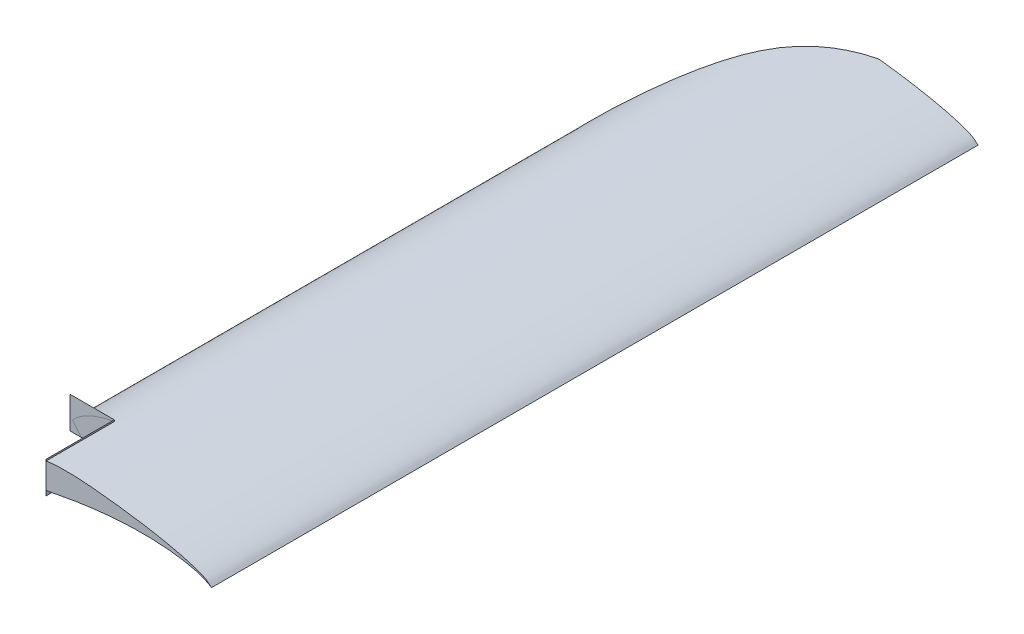
ISO-10303-21;
HEADER;
FILE_DESCRIPTION(('STEP AP214'),'2;1');
FILE_NAME('part.step','',(''),(''),'','','');
FILE_SCHEMA(('AUTOMOTIVE_DESIGN { 1 0 10303 214 1 1 1 1 }'));
ENDSEC;
DATA;
#1=APPLICATION_CONTEXT('core data for automotive mechanical design processes');
#2=APPLICATION_PROTOCOL_DEFINITION('international standard','automotive_design',2000,#1);
#3=PRODUCT_CONTEXT('',#1,'mechanical');
#4=PRODUCT('Part','Part','',(#3));
#5=PRODUCT_RELATED_PRODUCT_CATEGORY('part','',(#4));
#6=PRODUCT_DEFINITION_FORMATION('','',#4);
#7=PRODUCT_DEFINITION_CONTEXT('part definition',#1,'design');
#8=PRODUCT_DEFINITION('design','',#6,#7);
#9=PRODUCT_DEFINITION_SHAPE('','',#8);
#10=(LENGTH_UNIT() NAMED_UNIT(*) SI_UNIT(.MILLI.,.METRE.));
#11=(NAMED_UNIT(*) PLANE_ANGLE_UNIT() SI_UNIT($,.RADIAN.));
#12=(NAMED_UNIT(*) SI_UNIT($,.STERADIAN.) SOLID_ANGLE_UNIT());
#13=UNCERTAINTY_MEASURE_WITH_UNIT(LENGTH_MEASURE(1.E-05),#10,'distance_accuracy_value','');
#14=(GEOMETRIC_REPRESENTATION_CONTEXT(3) GLOBAL_UNCERTAINTY_ASSIGNED_CONTEXT((#13)) GLOBAL_UNIT_ASSIGNED_CONTEXT((#10,
#11,#12)) REPRESENTATION_CONTEXT('',''));
#15=CARTESIAN_POINT('',(0.,0.,0.));
#16=DIRECTION('',(0.,0.,1.));
#17=DIRECTION('',(1.,0.,0.));
#18=AXIS2_PLACEMENT_3D('',#15,#16,#17);
#19=CARTESIAN_POINT('',(-0.000448500784880232,0.,84.4464684884602));
#20=DIRECTION('',(0.,0.,1.));
#21=DIRECTION('',(1.,0.,0.));
#22=AXIS2_PLACEMENT_3D('',#19,#20,#21);
#23=PLANE('',#22);
#24=DIRECTION('',(1.,0.,0.));
#25=VECTOR('',#24,1.);
#26=CARTESIAN_POINT('',(-0.000448500784880232,3.43906675841477,84.4464684884602));
#27=LINE('',#26,#25);
#28=CARTESIAN_POINT('',(-0.000448500784880232,3.43906675841477,84.4464684884602));
#29=VERTEX_POINT('',#28);
#30=CARTESIAN_POINT('',(5.38107816998865,3.43906675841477,84.4464684884602));
#31=VERTEX_POINT('',#30);
#32=EDGE_CURVE('E60',#29,#31,#27,.T.);
#33=ORIENTED_EDGE('',*,*,#32,.F.);
#34=DIRECTION('',(0.,1.,0.));
#35=VECTOR('',#34,1.);
#36=CARTESIAN_POINT('',(-0.000448500784880232,0.,84.4464684884602));
#37=LINE('',#36,#35);
#38=CARTESIAN_POINT('',(-0.000448500784880232,-0.404933087172944,84.4464684884602));
#39=VERTEX_POINT('',#38);
#40=EDGE_CURVE('E12',#39,#29,#37,.T.);
#41=ORIENTED_EDGE('',*,*,#40,.F.);
#42=DIRECTION('',(1.,0.,0.));
#43=VECTOR('',#42,1.);
#44=CARTESIAN_POINT('',(-0.000448500784880232,-0.404933087172944,84.4464684884602));
#45=LINE('',#44,#43);
#46=CARTESIAN_POINT('',(5.38107816998865,-0.404933087172944,84.4464684884602));
#47=VERTEX_POINT('',#46);
#48=EDGE_CURVE('E87',#39,#47,#45,.T.);
#49=ORIENTED_EDGE('',*,*,#48,.T.);
#50=DIRECTION('',(0.,1.,0.));
#51=VECTOR('',#50,1.);
#52=CARTESIAN_POINT('',(5.38107816998865,0.,84.4464684884602));
#53=LINE('',#52,#51);
#54=EDGE_CURVE('E95',#47,#31,#53,.T.);
#55=ORIENTED_EDGE('',*,*,#54,.T.);
#56=EDGE_LOOP('',(#33,#41,#49,#55));
#57=FACE_BOUND('',#56,.T.);
#58=ADVANCED_FACE('F54',(#57),#23,.T.);
#59=CARTESIAN_POINT('',(5.38107816998865,0.,84.4464684884602));
#60=DIRECTION('',(-1.,0.,0.));
#61=DIRECTION('',(0.,0.,1.));
#62=AXIS2_PLACEMENT_3D('',#59,#60,#61);
#63=PLANE('',#62);
#64=DIRECTION('',(0.,0.,1.));
#65=VECTOR('',#64,1.);
#66=CARTESIAN_POINT('',(5.38107816998865,3.43906675841477,84.4464684884602));
#67=LINE('',#66,#65);
#68=CARTESIAN_POINT('',(5.38107816998865,3.43906675841477,92.71));
#69=VERTEX_POINT('',#68);
#70=EDGE_CURVE('E71',#31,#69,#67,.T.);
#71=ORIENTED_EDGE('',*,*,#70,.F.);
#72=ORIENTED_EDGE('',*,*,#54,.F.);
#73=DIRECTION('',(0.,0.,1.));
#74=VECTOR('',#73,1.);
#75=CARTESIAN_POINT('',(5.38107816998865,-0.404933087172944,84.4464684884602));
#76=LINE('',#75,#74);
#77=CARTESIAN_POINT('',(5.38107816998865,-0.404933087172944,92.71));
#78=VERTEX_POINT('',#77);
#79=EDGE_CURVE('E89',#47,#78,#76,.T.);
#80=ORIENTED_EDGE('',*,*,#79,.T.);
#81=DIRECTION('',(0.,1.,0.));
#82=VECTOR('',#81,1.);
#83=CARTESIAN_POINT('',(5.38107816998865,0.,92.71));
#84=LINE('',#83,#82);
#85=EDGE_CURVE('E67',#78,#69,#84,.T.);
#86=ORIENTED_EDGE('',*,*,#85,.T.);
#87=EDGE_LOOP('',(#71,#72,#80,#86));
#88=FACE_BOUND('',#87,.T.);
#89=ADVANCED_FACE('F102',(#88),#63,.T.);
#90=OPEN_SHELL('',(#58,#89));
#91=SHELL_BASED_SURFACE_MODEL('B2',(#90));
#92=CARTESIAN_POINT('',(25.4,0.,92.71));
#93=CARTESIAN_POINT('',(25.4001520599452,0.000646612761191379,92.71));
#94=CARTESIAN_POINT('',(25.3166529270275,0.0628591543607271,92.71));
#95=CARTESIAN_POINT('',(25.2460358365065,0.132146753687471,92.71));
#96=CARTESIAN_POINT('',(25.0892373698151,0.276867549706666,92.71));
#97=CARTESIAN_POINT('',(24.9042518394119,0.430822803541319,92.71));
#98=CARTESIAN_POINT('',(24.651207522736,0.586026829106723,92.71));
#99=CARTESIAN_POINT('',(24.3365449916284,0.73643707574033,92.71));
#100=CARTESIAN_POINT('',(23.9566732624163,0.893408386347102,92.71));
#101=CARTESIAN_POINT('',(23.5121713711275,1.05475508080588,92.71));
#102=CARTESIAN_POINT('',(23.0051130518007,1.21933736451059,92.71));
#103=CARTESIAN_POINT('',(22.4381306210965,1.38572627095531,92.71));
#104=CARTESIAN_POINT('',(21.8143990225729,1.55314085053527,92.71));
#105=CARTESIAN_POINT('',(21.1373622325816,1.72004391765057,92.71));
#106=CARTESIAN_POINT('',(20.4109018797338,1.88522726899632,92.71));
#107=CARTESIAN_POINT('',(19.6393478468162,2.04765917046604,92.71));
#108=CARTESIAN_POINT('',(18.8274116006266,2.20650459795675,92.71));
#109=CARTESIAN_POINT('',(17.9798385439665,2.35980886472245,92.71));
#110=CARTESIAN_POINT('',(17.1019660037303,2.50735294287643,92.71));
#111=CARTESIAN_POINT('',(16.1988532293159,2.647236918757,92.71));
#112=CARTESIAN_POINT('',(15.2763406744208,2.77973394319745,92.71));
#113=CARTESIAN_POINT('',(14.3403405433433,2.9037940433712,92.71));
#114=CARTESIAN_POINT('',(13.3976322893663,3.01902023375094,92.71));
#115=CARTESIAN_POINT('',(12.4557521499271,3.12622837823635,92.71));
#116=CARTESIAN_POINT('',(11.5224974897527,3.22271333843028,92.71));
#117=CARTESIAN_POINT('',(10.6054713916608,3.30666928862412,92.71));
#118=CARTESIAN_POINT('',(9.71112346774048,3.3733707294072,92.71));
#119=CARTESIAN_POINT('',(8.84456256172235,3.41925275986724,92.71));
#120=CARTESIAN_POINT('',(8.01060963517704,3.43906675841477,92.71));
#121=CARTESIAN_POINT('',(7.2135369103709,3.4369576877202,92.71));
#122=CARTESIAN_POINT('',(6.45483123627465,3.39793067661246,92.71));
#123=CARTESIAN_POINT('',(5.73419871105363,3.31884419669793,92.71));
#124=CARTESIAN_POINT('',(5.04870580090872,3.20701474127177,92.71));
#125=CARTESIAN_POINT('',(4.39818706155141,3.0621406690182,92.71));
#126=CARTESIAN_POINT('',(3.78331080601426,2.89225561033363,92.71));
#127=CARTESIAN_POINT('',(3.20667865205361,2.70036849010022,92.71));
#128=CARTESIAN_POINT('',(2.6707429618467,2.49096659420097,92.71));
#129=CARTESIAN_POINT('',(2.17883410663409,2.26517182562478,92.71));
#130=CARTESIAN_POINT('',(1.73252960089017,2.02756845235453,92.71));
#131=CARTESIAN_POINT('',(1.33425753408792,1.78085853527256,92.71));
#132=CARTESIAN_POINT('',(0.986515358696794,1.52838503770296,92.71));
#133=CARTESIAN_POINT('',(0.689447049686401,1.2754999924099,92.71));
#134=CARTESIAN_POINT('',(0.447359030696613,1.01944119100104,92.71));
#135=CARTESIAN_POINT('',(0.261408219195304,0.762431773330942,92.71));
#136=CARTESIAN_POINT('',(0.124039427880301,0.512382132457917,92.71));
#137=CARTESIAN_POINT('',(0.0360360916252268,0.275014655791144,92.71));
#138=CARTESIAN_POINT('',(-0.00598505407995298,0.0558784648315089,92.71));
#139=CARTESIAN_POINT('',(0.00234645764251519,-0.129148410309268,92.71));
#140=CARTESIAN_POINT('',(0.0493743967528639,-0.29967784360662,92.71));
#141=CARTESIAN_POINT('',(0.228085036601866,-0.380932307561465,92.71));
#142=CARTESIAN_POINT('',(0.465273564971756,-0.397183696395702,92.71));
#143=CARTESIAN_POINT('',(0.792023237382908,-0.404933087172944,92.71));
#144=CARTESIAN_POINT('',(1.20210925084225,-0.389691115688613,92.71));
#145=CARTESIAN_POINT('',(1.69168219048195,-0.355264238863741,92.71));
#146=CARTESIAN_POINT('',(2.25537593351741,-0.30496793529767,92.71));
#147=CARTESIAN_POINT('',(2.88687394190906,-0.232482861751117,92.71));
#148=CARTESIAN_POINT('',(3.58393454339052,-0.143855324067597,92.71));
#149=CARTESIAN_POINT('',(4.34513340177194,-0.0157988242077618,92.71));
#150=CARTESIAN_POINT('',(5.17554921303378,0.140016021553274,92.71));
#151=CARTESIAN_POINT('',(6.07795112780296,0.313107423268778,92.71));
#152=CARTESIAN_POINT('',(7.04880245204458,0.494840094196206,92.71));
#153=CARTESIAN_POINT('',(8.08169635828331,0.678943781168348,92.71));
#154=CARTESIAN_POINT('',(9.16911630877212,0.858127208402739,92.71));
#155=CARTESIAN_POINT('',(10.302605892068,1.02651842843621,92.71));
#156=CARTESIAN_POINT('',(11.4724025221965,1.17790828582212,92.71));
#157=CARTESIAN_POINT('',(12.6679849138802,1.3078977163478,92.71));
#158=CARTESIAN_POINT('',(13.8780596965338,1.41064855240095,92.71));
#159=CARTESIAN_POINT('',(15.0904833467788,1.48348633972841,92.71));
#160=CARTESIAN_POINT('',(16.2925891834725,1.52352928035723,92.71));
#161=CARTESIAN_POINT('',(17.4713364587631,1.52858699387778,92.71));
#162=CARTESIAN_POINT('',(18.6135744030311,1.49831581923959,92.71));
#163=CARTESIAN_POINT('',(19.7062237145305,1.43342441393416,92.71));
#164=CARTESIAN_POINT('',(20.7361454401572,1.33475005096978,92.71));
#165=CARTESIAN_POINT('',(21.6910777450694,1.20608033488656,92.71));
#166=CARTESIAN_POINT('',(22.5585877164588,1.05114877579762,92.71));
#167=CARTESIAN_POINT('',(23.3285041840437,0.875144223628761,92.71));
#168=CARTESIAN_POINT('',(23.9866379409832,0.686811511814654,92.71));
#169=CARTESIAN_POINT('',(24.5252525480906,0.485806582942928,92.71));
#170=CARTESIAN_POINT('',(24.9095402055382,0.301861339295619,92.71));
#171=CARTESIAN_POINT('',(25.1928652365436,0.131779388429329,92.71));
#172=CARTESIAN_POINT('',(25.3017065300599,0.06596047918706,92.71));
#173=CARTESIAN_POINT('',(25.3998448486899,-0.000659758340167158,92.71));
#174=CARTESIAN_POINT('',(25.4,0.,92.71));
#175=B_SPLINE_CURVE_WITH_KNOTS('',3,(#92,#93,#94,#95,#96,#97,#98,#99,#100,#101,#102,#103,#104,
#105,#106,#107,#108,#109,#110,#111,#112,#113,#114,#115,#116,#117,#118,#119,#120,#121,#122,#123,
#124,#125,#126,#127,#128,#129,#130,#131,#132,#133,#134,#135,#136,#137,#138,#139,#140,#141,#142,
#143,#144,#145,#146,#147,#148,#149,#150,#151,#152,#153,#154,#155,#156,#157,#158,#159,#160,#161,
#162,#163,#164,#165,#166,#167,#168,#169,#170,#171,#172,#173,#174),.UNSPECIFIED.,.T.,.F.,(4,1,1,
1,1,1,1,1,1,1,1,1,1,1,1,1,1,1,1,1,1,1,1,1,1,1,1,1,1,1,1,1,1,1,1,1,1,1,1,1,1,1,1,1,1,1,1,1,1,1,1,
1,1,1,1,1,1,1,1,1,1,1,1,1,1,1,1,1,1,1,1,1,1,1,1,1,1,1,1,1,4),(0.,0.000979693242376245,
0.00364892058829763,0.00748361833490655,0.0120954708384435,0.0175258713723999,
0.0240521650777079,0.0317835594190071,0.0406784793603864,0.0507111126936803,0.0618342190503259,
0.0739904350981347,0.0871195680063832,0.101146668164425,0.11599249419349,0.131572528164215,
0.147790745486094,0.164553551444118,0.181760805206571,0.199315146051713,0.217098547538304,
0.234993990802525,0.252860931516713,0.270544925251392,0.287891388510998,0.304778317210446,
0.321106560245893,0.336811455647682,0.351805665119609,0.366036923775236,0.379621752801001,
0.392659249495377,0.405176845734916,0.417178598229742,0.428610379117926,0.439425994476903,
0.449603784382892,0.459109429610699,0.46791536902845,0.475995921602892,0.483316706820926,
0.489882351009509,0.495811187835131,0.501157435406827,0.50591117307637,0.51005493470011,
0.513582766446283,0.516454870807448,0.519341319703977,0.523819202354036,0.529969265396551,
0.537710949512838,0.546963923143322,0.557632757721201,0.56961765251618,0.582800258734577,
0.597244869485877,0.613128842707955,0.630437683503853,0.649050504780563,0.668816954435701,
0.689589994226548,0.711185026832726,0.733422420961212,0.756090212420495,0.778985015155249,
0.801886510816547,0.824563789032701,0.846789831930368,0.868336182522587,0.888976385430958,
0.908490546241202,0.926657593343553,0.943285285019282,0.958168540622044,0.971135359501447,
0.981955334178369,0.990251634951136,0.995852498846973,0.999000389682579,1.),.UNSPECIFIED.);
#176=DIRECTION('',(0.,0.,-1.));
#177=VECTOR('',#176,1.);
#178=SURFACE_OF_LINEAR_EXTRUSION('',#175,#177);
#179=CARTESIAN_POINT('',(25.4,0.,0.));
#180=CARTESIAN_POINT('',(25.4001520599452,0.000646612761191379,0.));
#181=CARTESIAN_POINT('',(25.3166529270275,0.0628591543607271,0.));
#182=CARTESIAN_POINT('',(25.2460358365065,0.132146753687471,0.));
#183=CARTESIAN_POINT('',(25.0892373698151,0.276867549706666,0.));
#184=CARTESIAN_POINT('',(24.9042518394119,0.430822803541319,0.));
#185=CARTESIAN_POINT('',(24.651207522736,0.586026829106723,0.));
#186=CARTESIAN_POINT('',(24.3365449916284,0.73643707574033,0.));
#187=CARTESIAN_POINT('',(23.9566732624163,0.893408386347102,0.));
#188=CARTESIAN_POINT('',(23.5121713711275,1.05475508080588,0.));
#189=CARTESIAN_POINT('',(23.0051130518007,1.21933736451059,0.));
#190=CARTESIAN_POINT('',(22.4381306210965,1.38572627095531,0.));
#191=CARTESIAN_POINT('',(21.8143990225729,1.55314085053527,0.));
#192=CARTESIAN_POINT('',(21.1373622325816,1.72004391765057,0.));
#193=CARTESIAN_POINT('',(20.4109018797338,1.88522726899632,0.));
#194=CARTESIAN_POINT('',(19.6393478468162,2.04765917046604,0.));
#195=CARTESIAN_POINT('',(18.8274116006266,2.20650459795675,0.));
#196=CARTESIAN_POINT('',(17.9798385439665,2.35980886472245,0.));
#197=CARTESIAN_POINT('',(17.1019660037303,2.50735294287643,0.));
#198=CARTESIAN_POINT('',(16.1988532293159,2.647236918757,0.));
#199=CARTESIAN_POINT('',(15.2763406744208,2.77973394319745,0.));
#200=CARTESIAN_POINT('',(14.3403405433433,2.9037940433712,0.));
#201=CARTESIAN_POINT('',(13.3976322893663,3.01902023375094,0.));
#202=CARTESIAN_POINT('',(12.4557521499271,3.12622837823635,0.));
#203=CARTESIAN_POINT('',(11.5224974897527,3.22271333843028,0.));
#204=CARTESIAN_POINT('',(10.6054713916608,3.30666928862412,0.));
#205=CARTESIAN_POINT('',(9.71112346774048,3.3733707294072,0.));
#206=CARTESIAN_POINT('',(8.84456256172235,3.41925275986724,0.));
#207=CARTESIAN_POINT('',(8.01060963517704,3.43906675841477,0.));
#208=CARTESIAN_POINT('',(7.2135369103709,3.4369576877202,0.));
#209=CARTESIAN_POINT('',(6.45483123627465,3.39793067661246,0.));
#210=CARTESIAN_POINT('',(5.73419871105363,3.31884419669793,0.));
#211=CARTESIAN_POINT('',(5.04870580090872,3.20701474127177,0.));
#212=CARTESIAN_POINT('',(4.39818706155141,3.0621406690182,0.));
#213=CARTESIAN_POINT('',(3.78331080601426,2.89225561033363,0.));
#214=CARTESIAN_POINT('',(3.20667865205361,2.70036849010022,0.));
#215=CARTESIAN_POINT('',(2.6707429618467,2.49096659420097,0.));
#216=CARTESIAN_POINT('',(2.17883410663409,2.26517182562478,0.));
#217=CARTESIAN_POINT('',(1.73252960089017,2.02756845235453,0.));
#218=CARTESIAN_POINT('',(1.33425753408792,1.78085853527256,0.));
#219=CARTESIAN_POINT('',(0.986515358696794,1.52838503770296,0.));
#220=CARTESIAN_POINT('',(0.689447049686401,1.2754999924099,0.));
#221=CARTESIAN_POINT('',(0.447359030696613,1.01944119100104,0.));
#222=CARTESIAN_POINT('',(0.261408219195304,0.762431773330942,0.));
#223=CARTESIAN_POINT('',(0.124039427880301,0.512382132457917,0.));
#224=CARTESIAN_POINT('',(0.0360360916252268,0.275014655791144,0.));
#225=CARTESIAN_POINT('',(-0.00598505407995298,0.0558784648315089,0.));
#226=CARTESIAN_POINT('',(0.00234645764251519,-0.129148410309268,0.));
#227=CARTESIAN_POINT('',(0.0493743967528639,-0.29967784360662,0.));
#228=CARTESIAN_POINT('',(0.228085036601866,-0.380932307561465,0.));
#229=CARTESIAN_POINT('',(0.465273564971756,-0.397183696395702,0.));
#230=CARTESIAN_POINT('',(0.792023237382908,-0.404933087172944,0.));
#231=CARTESIAN_POINT('',(1.20210925084225,-0.389691115688613,0.));
#232=CARTESIAN_POINT('',(1.69168219048195,-0.355264238863741,0.));
#233=CARTESIAN_POINT('',(2.25537593351741,-0.30496793529767,0.));
#234=CARTESIAN_POINT('',(2.88687394190906,-0.232482861751117,0.));
#235=CARTESIAN_POINT('',(3.58393454339052,-0.143855324067597,0.));
#236=CARTESIAN_POINT('',(4.34513340177194,-0.0157988242077618,0.));
#237=CARTESIAN_POINT('',(5.17554921303378,0.140016021553274,0.));
#238=CARTESIAN_POINT('',(6.07795112780296,0.313107423268778,0.));
#239=CARTESIAN_POINT('',(7.04880245204458,0.494840094196206,0.));
#240=CARTESIAN_POINT('',(8.08169635828331,0.678943781168348,0.));
#241=CARTESIAN_POINT('',(9.16911630877212,0.858127208402739,0.));
#242=CARTESIAN_POINT('',(10.302605892068,1.02651842843621,0.));
#243=CARTESIAN_POINT('',(11.4724025221965,1.17790828582212,0.));
#244=CARTESIAN_POINT('',(12.6679849138802,1.3078977163478,0.));
#245=CARTESIAN_POINT('',(13.8780596965338,1.41064855240095,0.));
#246=CARTESIAN_POINT('',(15.0904833467788,1.48348633972841,0.));
#247=CARTESIAN_POINT('',(16.2925891834725,1.52352928035723,0.));
#248=CARTESIAN_POINT('',(17.4713364587631,1.52858699387778,0.));
#249=CARTESIAN_POINT('',(18.6135744030311,1.49831581923959,0.));
#250=CARTESIAN_POINT('',(19.7062237145305,1.43342441393416,0.));
#251=CARTESIAN_POINT('',(20.7361454401572,1.33475005096978,0.));
#252=CARTESIAN_POINT('',(21.6910777450694,1.20608033488656,0.));
#253=CARTESIAN_POINT('',(22.5585877164588,1.05114877579762,0.));
#254=CARTESIAN_POINT('',(23.3285041840437,0.875144223628761,0.));
#255=CARTESIAN_POINT('',(23.9866379409832,0.686811511814654,0.));
#256=CARTESIAN_POINT('',(24.5252525480906,0.485806582942928,0.));
#257=CARTESIAN_POINT('',(24.9095402055382,0.301861339295619,0.));
#258=CARTESIAN_POINT('',(25.1928652365436,0.131779388429329,0.));
#259=CARTESIAN_POINT('',(25.3017065300599,0.06596047918706,0.));
#260=CARTESIAN_POINT('',(25.3998448486899,-0.000659758340167158,0.));
#261=CARTESIAN_POINT('',(25.4,0.,0.));
#262=B_SPLINE_CURVE_WITH_KNOTS('',3,(#179,#180,#181,#182,#183,#184,#185,#186,#187,#188,#189,
#190,#191,#192,#193,#194,#195,#196,#197,#198,#199,#200,#201,#202,#203,#204,#205,#206,#207,#208,
#209,#210,#211,#212,#213,#214,#215,#216,#217,#218,#219,#220,#221,#222,#223,#224,#225,#226,#227,
#228,#229,#230,#231,#232,#233,#234,#235,#236,#237,#238,#239,#240,#241,#242,#243,#244,#245,#246,
#247,#248,#249,#250,#251,#252,#253,#254,#255,#256,#257,#258,#259,#260,#261),.UNSPECIFIED.,.T.,
.F.,(4,1,1,1,1,1,1,1,1,1,1,1,1,1,1,1,1,1,1,1,1,1,1,1,1,1,1,1,1,1,1,1,1,1,1,1,1,1,1,1,1,1,1,1,1,
1,1,1,1,1,1,1,1,1,1,1,1,1,1,1,1,1,1,1,1,1,1,1,1,1,1,1,1,1,1,1,1,1,1,1,4),(0.,
0.000979693242376245,0.00364892058829763,0.00748361833490655,0.0120954708384435,
0.0175258713723999,0.0240521650777079,0.0317835594190071,0.0406784793603864,0.0507111126936803,
0.0618342190503259,0.0739904350981347,0.0871195680063832,0.101146668164425,0.11599249419349,
0.131572528164215,0.147790745486094,0.164553551444118,0.181760805206571,0.199315146051713,
0.217098547538304,0.234993990802525,0.252860931516713,0.270544925251392,0.287891388510998,
0.304778317210446,0.321106560245893,0.336811455647682,0.351805665119609,0.366036923775236,
0.379621752801001,0.392659249495377,0.405176845734916,0.417178598229742,0.428610379117926,
0.439425994476903,0.449603784382892,0.459109429610699,0.46791536902845,0.475995921602892,
0.483316706820926,0.489882351009509,0.495811187835131,0.501157435406827,0.50591117307637,
0.51005493470011,0.513582766446283,0.516454870807448,0.519341319703977,0.523819202354036,
0.529969265396551,0.537710949512838,0.546963923143322,0.557632757721201,0.56961765251618,
0.582800258734577,0.597244869485877,0.613128842707955,0.630437683503853,0.649050504780563,
0.668816954435701,0.689589994226548,0.711185026832726,0.733422420961212,0.756090212420495,
0.778985015155249,0.801886510816547,0.824563789032701,0.846789831930368,0.868336182522587,
0.888976385430958,0.908490546241202,0.926657593343553,0.943285285019282,0.958168540622044,
0.971135359501447,0.981955334178369,0.990251634951136,0.995852498846973,0.999000389682579,1.),.UNSPECIFIED.);
#263=CARTESIAN_POINT('',(13.3886830601575,1.36770737884476,0.));
#264=VERTEX_POINT('',#263);
#265=CARTESIAN_POINT('',(13.388683058612,3.01875243571918,0.));
#266=VERTEX_POINT('',#265);
#267=EDGE_CURVE('E240',#264,#266,#262,.T.);
#268=ORIENTED_EDGE('',*,*,#267,.T.);
#269=CARTESIAN_POINT('',(13.3886830586116,3.01875243361638,1.52655665885959E-13));
#270=CARTESIAN_POINT('',(13.2578222490079,3.03418691216912,0.0506335916544272));
#271=CARTESIAN_POINT('',(13.127596126782,3.04931740591399,0.102977177508178));
#272=CARTESIAN_POINT('',(12.8685101382564,3.07892779218235,0.211127564569407));
#273=CARTESIAN_POINT('',(12.7396503204335,3.09340766168016,0.266934488178759));
#274=CARTESIAN_POINT('',(12.3552004640044,3.13581448989893,0.439645055436173));
#275=CARTESIAN_POINT('',(12.1018208515215,3.16269909631697,0.56180732079967));
#276=CARTESIAN_POINT('',(11.7270050887127,3.20077960305321,0.755575800152981));
#277=CARTESIAN_POINT('',(11.6029328967342,3.21309955426028,0.821924906606126));
#278=CARTESIAN_POINT('',(11.3566480717317,3.2369716434663,0.958123380208667));
#279=CARTESIAN_POINT('',(11.234435443242,3.24852377959326,1.02797275589123));
#280=CARTESIAN_POINT('',(10.8728034152025,3.28169900413964,1.24154005762101));
#281=CARTESIAN_POINT('',(10.6362611609027,3.3020592719113,1.39037676457406));
#282=CARTESIAN_POINT('',(10.1718690158213,3.33884499084943,1.70137278993453));
#283=CARTESIAN_POINT('',(9.94401757998197,3.35527114419166,1.86352972394785));
#284=CARTESIAN_POINT('',(9.49771038035376,3.38386432988682,2.20064020001433));
#285=CARTESIAN_POINT('',(9.27925378449359,3.39603174010739,2.37559260509119));
#286=CARTESIAN_POINT('',(8.96006902110985,3.41062148508356,2.64620395667091));
#287=CARTESIAN_POINT('',(8.85555011455285,3.41486331803881,2.73733598392903));
#288=CARTESIAN_POINT('',(8.64901972011741,3.42215930710259,2.92245073868207));
#289=CARTESIAN_POINT('',(8.54700823536433,3.42521346173081,3.0164334697299));
#290=CARTESIAN_POINT('',(8.34553482404415,3.43023904694849,3.20714279516385));
#291=CARTESIAN_POINT('',(8.24607321300276,3.43221034415395,3.30386972603195));
#292=CARTESIAN_POINT('',(8.0497461719867,3.43519446310717,3.49993747279107));
#293=CARTESIAN_POINT('',(7.95288075109487,3.43620728150209,3.59927829782445));
#294=CARTESIAN_POINT('',(7.76177630162387,3.43720850981475,3.80044299879416));
#295=CARTESIAN_POINT('',(7.66753702139595,3.43719701822655,3.90226663505077));
#296=CARTESIAN_POINT('',(7.48169084164181,3.43593250891723,4.10827344027539));
#297=CARTESIAN_POINT('',(7.39008392455919,3.43467949947833,4.21245659349843));
#298=CARTESIAN_POINT('',(7.11899259820126,3.42880166451614,4.52861461817267));
#299=CARTESIAN_POINT('',(6.94345509160305,3.42205606812444,4.74396858846558));
#300=CARTESIAN_POINT('',(6.68803203996488,3.40766815926658,5.07286655778516));
#301=CARTESIAN_POINT('',(6.6042023755704,3.40216036330468,5.18348062487898));
#302=CARTESIAN_POINT('',(6.43912985970323,3.38975052397207,5.40654632526213));
#303=CARTESIAN_POINT('',(6.35788698716905,3.38284849195652,5.51899794357895));
#304=CARTESIAN_POINT('',(6.1179807260993,3.36024226373468,5.85892736104687));
#305=CARTESIAN_POINT('',(5.96313446677472,3.34263762799078,6.0889864747141));
#306=CARTESIAN_POINT('',(5.68586418825576,3.30654765891123,6.51987578972314));
#307=CARTESIAN_POINT('',(5.56207375182193,3.28859614834336,6.71987765309478));
#308=CARTESIAN_POINT('',(5.32123657602009,3.25024575831869,7.12367891607533));
#309=CARTESIAN_POINT('',(5.20419022290095,3.22984673889335,7.32747853230724));
#310=CARTESIAN_POINT('',(4.86253930681458,3.16527818289525,7.9441195036121));
#311=CARTESIAN_POINT('',(4.64756925751229,3.11775685161011,8.36197327049919));
#312=CARTESIAN_POINT('',(4.2403670323647,3.01786065225709,9.20811812961196));
#313=CARTESIAN_POINT('',(4.04814385115942,2.9654838787373,9.63641327040168));
#314=CARTESIAN_POINT('',(3.68304999579142,2.8572267476806,10.5021870334397));
#315=CARTESIAN_POINT('',(3.51023697575723,2.80133668348789,10.9396886580771));
#316=CARTESIAN_POINT('',(3.26392969288736,2.71585711262015,11.6003524686469));
#317=CARTESIAN_POINT('',(3.18399633002383,2.68709669635332,11.8212572811273));
#318=CARTESIAN_POINT('',(3.02806949639062,2.62907284295834,12.2643905980649));
#319=CARTESIAN_POINT('',(2.9520760248075,2.59980940593404,12.4866191022488));
#320=CARTESIAN_POINT('',(2.80372352882709,2.54073675181366,12.9321321278632));
#321=CARTESIAN_POINT('',(2.73136337950983,2.51092770759327,13.1554162987266));
#322=CARTESIAN_POINT('',(2.58992898423744,2.45071558032599,13.602941602966));
#323=CARTESIAN_POINT('',(2.52085473513795,2.42031249784758,13.827182735426));
#324=CARTESIAN_POINT('',(2.39045778728169,2.36107999265791,14.260579375179));
#325=CARTESIAN_POINT('',(2.32893243649849,2.33229143786081,14.4696796165765));
#326=CARTESIAN_POINT('',(2.2081971253694,2.27418212426927,14.888471830579));
#327=CARTESIAN_POINT('',(2.14898716160504,2.24486136626069,15.09816380231));
#328=CARTESIAN_POINT('',(1.97443987129817,2.15598044305076,15.7280615563784));
#329=CARTESIAN_POINT('',(1.8622106226593,2.09551324517812,16.1490037503288));
#330=CARTESIAN_POINT('',(1.69862210183188,2.00212538038297,16.7814289692295));
#331=CARTESIAN_POINT('',(1.64486340130593,1.97053430245122,16.9924956073266));
#332=CARTESIAN_POINT('',(1.5387155109098,1.90624509551452,17.4148066652636));
#333=CARTESIAN_POINT('',(1.48632632621133,1.87354696233006,17.6260510857718));
#334=CARTESIAN_POINT('',(1.3824867978505,1.80665298821375,18.0494165476082));
#335=CARTESIAN_POINT('',(1.33104084847401,1.77245186279668,18.2615378309619));
#336=CARTESIAN_POINT('',(1.22906299859136,1.70236083795887,18.6857185394473));
#337=CARTESIAN_POINT('',(1.17853108468107,1.66647096333114,18.8977779654411));
#338=CARTESIAN_POINT('',(1.07818255959149,1.59265701770066,19.321548925557));
#339=CARTESIAN_POINT('',(1.02836546617874,1.5547344085564,19.5332605997717));
#340=CARTESIAN_POINT('',(0.929172968085552,1.47637640947431,19.9563426241991));
#341=CARTESIAN_POINT('',(0.879797595015415,1.43594084132425,20.1677129491112));
#342=CARTESIAN_POINT('',(0.781376977890895,1.35138800757098,20.5894005858259));
#343=CARTESIAN_POINT('',(0.7323313118879,1.30727719885318,20.7997190838971));
#344=CARTESIAN_POINT('',(0.634320403338584,1.21363558312185,21.2191551493033));
#345=CARTESIAN_POINT('',(0.58535514846993,1.16410570456513,21.4282729159195));
#346=CARTESIAN_POINT('',(0.511688779584086,1.08345409824503,21.7413143708162));
#347=CARTESIAN_POINT('',(0.486986897106916,1.05537191176428,21.8460184404442));
#348=CARTESIAN_POINT('',(0.437575079540442,0.996536662908134,22.0547751787526));
#349=CARTESIAN_POINT('',(0.412865154352756,0.965781437791854,22.1588272455438));
#350=CARTESIAN_POINT('',(0.363427521227159,0.900977305945905,22.3661698627127));
#351=CARTESIAN_POINT('',(0.338699897214479,0.866921183365562,22.4694581881885));
#352=CARTESIAN_POINT('',(0.289546512388364,0.795193601993922,22.6737980253671));
#353=CARTESIAN_POINT('',(0.265120004662264,0.757556422778072,22.7748612050389));
#354=CARTESIAN_POINT('',(0.228656833082067,0.697362250410126,22.9249153625572));
#355=CARTESIAN_POINT('',(0.216540074761707,0.67668982326568,22.9746432682507));
#356=CARTESIAN_POINT('',(0.192397569748411,0.633791474518446,23.0734441230512));
#357=CARTESIAN_POINT('',(0.180371810705503,0.611565768067222,23.1225171617498));
#358=CARTESIAN_POINT('',(0.156499623542291,0.565247219609837,23.219641968626));
#359=CARTESIAN_POINT('',(0.144652780449229,0.541159907571018,23.2676962592696));
#360=CARTESIAN_POINT('',(0.121196674711504,0.4905384739473,23.3625492225961));
#361=CARTESIAN_POINT('',(0.109587287025582,0.464005682889621,23.4093485603836));
#362=CARTESIAN_POINT('',(0.0928096710742347,0.422535806206257,23.4767719373847));
#363=CARTESIAN_POINT('',(0.0874821584029667,0.408887598451194,23.4981491076672));
#364=CARTESIAN_POINT('',(0.0769462163014517,0.380715699940399,23.5403634491468));
#365=CARTESIAN_POINT('',(0.0717378269295547,0.366191720484473,23.5612004389993));
#366=CARTESIAN_POINT('',(0.0615009607220749,0.336163355076492,23.6020950030311));
#367=CARTESIAN_POINT('',(0.056471943599376,0.320662387026952,23.6221549369013));
#368=CARTESIAN_POINT('',(0.04663791485965,0.288445809264428,23.6613257181083));
#369=CARTESIAN_POINT('',(0.0418327848970066,0.271730853495435,23.6804370672189));
#370=CARTESIAN_POINT('',(0.0334861532496266,0.240378388636062,23.7135891742319));
#371=CARTESIAN_POINT('',(0.0298866912114238,0.226011665284638,23.7278695836255));
#372=CARTESIAN_POINT('',(0.022972732749807,0.196044320041467,23.7552721438179));
#373=CARTESIAN_POINT('',(0.0196591269820889,0.180440113165077,23.7683906776684));
#374=CARTESIAN_POINT('',(0.0134466879424129,0.147519883676018,23.7929636775716));
#375=CARTESIAN_POINT('',(0.0105542228805725,0.130183176012173,23.8043926279364));
#376=CARTESIAN_POINT('',(0.00554691924107547,0.0937289715747411,23.8241642449017));
#377=CARTESIAN_POINT('',(0.00342773501727812,0.0746222075711178,23.8325241603812));
#378=CARTESIAN_POINT('',(0.00109339975804403,0.0435504178943145,23.841729815217));
#379=CARTESIAN_POINT('',(0.000450812743822353,0.0321274070781106,23.8442630531792));
#380=CARTESIAN_POINT('',(-0.000353943089264376,0.0090130824779049,23.8474354334304));
#381=CARTESIAN_POINT('',(-0.000517053784843378,-0.00267765976365362,23.8480782891612));
#382=CARTESIAN_POINT('',(-0.000326621303992977,-0.0260208007374755,23.8473276717455));
#383=CARTESIAN_POINT('',(2.82223098866451E-05,-0.0376730290852484,23.8459290730819));
#384=CARTESIAN_POINT('',(0.00122668058589111,-0.0605719351065508,23.8412041376147));
#385=CARTESIAN_POINT('',(0.00207155910541149,-0.0718174839326555,23.8378728160865));
#386=CARTESIAN_POINT('',(0.00451487016339926,-0.0972412622907082,23.8282350423175));
#387=CARTESIAN_POINT('',(0.0062697325599398,-0.11116799281988,23.8213105118663));
#388=CARTESIAN_POINT('',(0.00927703324098914,-0.131073587988073,23.8094354834629));
#389=CARTESIAN_POINT('',(0.0103433880432049,-0.13755147484063,23.8052234888012));
#390=CARTESIAN_POINT('',(0.0125828460336585,-0.150193033416291,23.7963746647278));
#391=CARTESIAN_POINT('',(0.013755914860798,-0.156356805291638,23.7917379720623));
#392=CARTESIAN_POINT('',(0.0162537520622136,-0.168465024385941,23.7818610772433));
#393=CARTESIAN_POINT('',(0.0175819925086919,-0.1743975110356,23.7766070354461));
#394=CARTESIAN_POINT('',(0.0203524603155834,-0.185793105694257,23.7656432361986));
#395=CARTESIAN_POINT('',(0.0217946761344018,-0.19125626111295,23.7599335248905));
#396=CARTESIAN_POINT('',(0.0262637647569631,-0.206883182068791,23.7422320792391));
#397=CARTESIAN_POINT('',(0.029441645881429,-0.216325501231962,23.7296341716347));
#398=CARTESIAN_POINT('',(0.0355071458888814,-0.231989176096612,23.7055638836456));
#399=CARTESIAN_POINT('',(0.038354933413161,-0.238485066008974,23.6942535931631));
#400=CARTESIAN_POINT('',(0.0441750083583767,-0.250428630051664,23.6711180258152));
#401=CARTESIAN_POINT('',(0.0471473753442099,-0.255875621469149,23.6592924196368));
#402=CARTESIAN_POINT('',(0.0531945987264376,-0.265930833314875,23.6352117565183));
#403=CARTESIAN_POINT('',(0.056270055912283,-0.270532467456946,23.6229541468718));
#404=CARTESIAN_POINT('',(0.0624735835742585,-0.278996122012335,23.5982066781936));
#405=CARTESIAN_POINT('',(0.0656016388309067,-0.282858352501399,23.5857168862381));
#406=CARTESIAN_POINT('',(0.0734308986432668,-0.291742451415002,23.5544274796031));
#407=CARTESIAN_POINT('',(0.0781524375325288,-0.296406166225681,23.5355327159828));
#408=CARTESIAN_POINT('',(0.0876278819146926,-0.304902025337012,23.4975626572017));
#409=CARTESIAN_POINT('',(0.092381802225804,-0.308733758267119,23.4784872775785));
#410=CARTESIAN_POINT('',(0.106685470908957,-0.319359348015987,23.4210169563165));
#411=CARTESIAN_POINT('',(0.116255578252377,-0.325262114700536,23.3824639519169));
#412=CARTESIAN_POINT('',(0.135402587261075,-0.335691234921895,23.3051332659319));
#413=CARTESIAN_POINT('',(0.144979481299651,-0.340215767331807,23.2663553554798));
#414=CARTESIAN_POINT('',(0.164136652991438,-0.348332333791739,23.188595882695));
#415=CARTESIAN_POINT('',(0.173716874898082,-0.35192191679726,23.1496140530153));
#416=CARTESIAN_POINT('',(0.192830409091006,-0.358435040478766,23.0716590680345));
#417=CARTESIAN_POINT('',(0.202363774520996,-0.361359755263465,23.0326860207883));
#418=CARTESIAN_POINT('',(0.221391749894086,-0.366688985791868,22.9547252755465));
#419=CARTESIAN_POINT('',(0.230886382939033,-0.369093877455048,22.915737608701));
#420=CARTESIAN_POINT('',(0.268481696818137,-0.377717303673521,22.7610347160708));
#421=CARTESIAN_POINT('',(0.296458072387429,-0.382136504330463,22.645189247176));
#422=CARTESIAN_POINT('',(0.352149641505626,-0.388570031325926,22.4133646614782));
#423=CARTESIAN_POINT('',(0.379864790457408,-0.390583954152821,22.2973855255168));
#424=CARTESIAN_POINT('',(0.421285570535339,-0.392967058290445,22.1233091692352));
#425=CARTESIAN_POINT('',(0.435074347470677,-0.393655322550391,22.0652353640138));
#426=CARTESIAN_POINT('',(0.462602432682975,-0.394953922440307,21.9490751462786));
#427=CARTESIAN_POINT('',(0.47634174098574,-0.395564258110933,21.8909887337714));
#428=CARTESIAN_POINT('',(0.517493027986324,-0.397253474075291,21.7167215935602));
#429=CARTESIAN_POINT('',(0.544840445260663,-0.398190676448296,21.6005242278712));
#430=CARTESIAN_POINT('',(0.599324404650893,-0.399704381777871,21.3684736306714));
#431=CARTESIAN_POINT('',(0.626461342543946,-0.400282039635381,21.2526204994469));
#432=CARTESIAN_POINT('',(0.680660998852546,-0.401081856045717,21.0208934281466));
#433=CARTESIAN_POINT('',(0.707723715902516,-0.401304008100882,20.9050194877294));
#434=CARTESIAN_POINT('',(0.788843722238487,-0.401422614062089,20.5574954174106));
#435=CARTESIAN_POINT('',(0.842858141554085,-0.400771935565026,20.3258350005256));
#436=CARTESIAN_POINT('',(0.969566220061404,-0.397834569826886,19.7836734203999));
#437=CARTESIAN_POINT('',(1.04235507269079,-0.395066087415983,19.4731972683924));
#438=CARTESIAN_POINT('',(1.18917098028591,-0.388116702413203,18.8525518774504));
#439=CARTESIAN_POINT('',(1.26319804317057,-0.383935790784911,18.5423826404921));
#440=CARTESIAN_POINT('',(1.41328325974057,-0.374428961009152,17.9224691307156));
#441=CARTESIAN_POINT('',(1.48934191143999,-0.369102759812509,17.6127249820335));
#442=CARTESIAN_POINT('',(1.64422830054425,-0.357488782103469,16.9939517107602));
#443=CARTESIAN_POINT('',(1.72305603447529,-0.351201006797329,16.6849225872725));
#444=CARTESIAN_POINT('',(1.96491280397278,-0.330822415689578,15.758849301836));
#445=CARTESIAN_POINT('',(2.13322937087904,-0.315221926303059,15.1431823439849));
#446=CARTESIAN_POINT('',(2.40070024810604,-0.287295390439331,14.2244969543942));
#447=CARTESIAN_POINT('',(2.4923108318134,-0.277237926410061,13.9192107213515));
#448=CARTESIAN_POINT('',(2.68133208113339,-0.255685508597838,13.310480954592));
#449=CARTESIAN_POINT('',(2.77874278079761,-0.244190546375121,13.0070374317049));
#450=CARTESIAN_POINT('',(2.98011515354794,-0.219835271584294,12.402530991492));
#451=CARTESIAN_POINT('',(3.08407388524192,-0.206975570307295,12.1014670726864));
#452=CARTESIAN_POINT('',(3.29938958831756,-0.179086623362336,11.5020861179876));
#453=CARTESIAN_POINT('',(3.4107465519432,-0.164057379968825,11.2037690792151));
#454=CARTESIAN_POINT('',(3.64157681838595,-0.130598817729538,10.6107402743064));
#455=CARTESIAN_POINT('',(3.76104375642695,-0.112172146161457,10.3160258903301));
#456=CARTESIAN_POINT('',(4.00899722467998,-0.0718143587448541,9.73065594961856));
#457=CARTESIAN_POINT('',(4.13748344177168,-0.0498833645214299,9.44000025239833));
#458=CARTESIAN_POINT('',(4.37370262596398,-0.00826773315309858,8.92965142795034));
#459=CARTESIAN_POINT('',(4.47943289092962,0.0107777060346423,8.70897831240219));
#460=CARTESIAN_POINT('',(4.69713480240189,0.050660500444637,8.27087829487306));
#461=CARTESIAN_POINT('',(4.80910670198585,0.0714979283446353,8.05345152497434));
#462=CARTESIAN_POINT('',(5.0396733938839,0.114821987332682,7.62226234497891));
#463=CARTESIAN_POINT('',(5.15826906014908,0.137308836171363,7.40850042331463));
#464=CARTESIAN_POINT('',(5.40241397615028,0.183746323338975,6.98516421633833));
#465=CARTESIAN_POINT('',(5.52796269297651,0.207696849500307,6.77558961176426));
#466=CARTESIAN_POINT('',(5.78627855311362,0.256953628315712,6.3612472125329));
#467=CARTESIAN_POINT('',(5.91904168191876,0.282259126874186,6.15647683355001));
#468=CARTESIAN_POINT('',(6.19211742919832,0.334028121037575,5.75219935282271));
#469=CARTESIAN_POINT('',(6.33243017570511,0.360491636279627,5.55269234042417));
#470=CARTESIAN_POINT('',(6.76507379542903,0.441463952280232,4.96296676526318));
#471=CARTESIAN_POINT('',(7.06918112452731,0.49756827457639,4.58142853636303));
#472=CARTESIAN_POINT('',(7.60572627999466,0.593820046089263,3.96598099745386));
#473=CARTESIAN_POINT('',(7.82944905199215,0.63324596226011,3.72430181038782));
#474=CARTESIAN_POINT('',(8.29160744591871,0.712606183970667,3.25542082530742));
#475=CARTESIAN_POINT('',(8.53004457097672,0.752540541117799,3.02822051120162));
#476=CARTESIAN_POINT('',(9.02124577751827,0.832223623568506,2.58977724930668));
#477=CARTESIAN_POINT('',(9.27401126303354,0.871972330265744,2.37853587007631));
#478=CARTESIAN_POINT('',(9.79277135879286,0.950396873072419,1.97356617460024));
#479=CARTESIAN_POINT('',(10.0587460598866,0.989074194668448,1.77981267203092));
#480=CARTESIAN_POINT('',(10.6032283824549,1.0644642365343,1.4104489985707));
#481=CARTESIAN_POINT('',(10.881734820597,1.10117714158412,1.23483711976296));
#482=CARTESIAN_POINT('',(11.4498638995442,1.17183247434283,0.902467997971052));
#483=CARTESIAN_POINT('',(11.7394779673845,1.20577697788864,0.745696585237168));
#484=CARTESIAN_POINT('',(12.1444099910515,1.24988231904191,0.543200856150254));
#485=CARTESIAN_POINT('',(12.2555342583079,1.26164854867184,0.489310152064671));
#486=CARTESIAN_POINT('',(12.4790680931486,1.28459327140803,0.384200703433228));
#487=CARTESIAN_POINT('',(12.5914773095741,1.29577192062783,0.332981249194705));
#488=CARTESIAN_POINT('',(12.8173430761396,1.31747191535565,0.233277358517857));
#489=CARTESIAN_POINT('',(12.9307976254661,1.32799430037146,0.184788609171755));
#490=CARTESIAN_POINT('',(13.1588838054004,1.34836602173239,0.0904299435003625));
#491=CARTESIAN_POINT('',(13.2735157214971,1.35821519018101,0.044560680926488));
#492=CARTESIAN_POINT('',(13.3886830586116,1.36770737871734,1.2490009027033E-13));
#493=B_SPLINE_CURVE_WITH_KNOTS('',3,(#269,#270,#271,#272,#273,#274,#275,#276,#277,#278,#279,
#280,#281,#282,#283,#284,#285,#286,#287,#288,#289,#290,#291,#292,#293,#294,#295,#296,#297,#298,
#299,#300,#301,#302,#303,#304,#305,#306,#307,#308,#309,#310,#311,#312,#313,#314,#315,#316,#317,
#318,#319,#320,#321,#322,#323,#324,#325,#326,#327,#328,#329,#330,#331,#332,#333,#334,#335,#336,
#337,#338,#339,#340,#341,#342,#343,#344,#345,#346,#347,#348,#349,#350,#351,#352,#353,#354,#355,
#356,#357,#358,#359,#360,#361,#362,#363,#364,#365,#366,#367,#368,#369,#370,#371,#372,#373,#374,
#375,#376,#377,#378,#379,#380,#381,#382,#383,#384,#385,#386,#387,#388,#389,#390,#391,#392,#393,
#394,#395,#396,#397,#398,#399,#400,#401,#402,#403,#404,#405,#406,#407,#408,#409,#410,#411,#412,
#413,#414,#415,#416,#417,#418,#419,#420,#421,#422,#423,#424,#425,#426,#427,#428,#429,#430,#431,
#432,#433,#434,#435,#436,#437,#438,#439,#440,#441,#442,#443,#444,#445,#446,#447,#448,#449,#450,
#451,#452,#453,#454,#455,#456,#457,#458,#459,#460,#461,#462,#463,#464,#465,#466,#467,#468,#469,
#470,#471,#472,#473,#474,#475,#476,#477,#478,#479,#480,#481,#482,#483,#484,#485,#486,#487,#488,
#489,#490,#491,#492),.UNSPECIFIED.,.F.,.F.,(4,2,2,2,2,2,2,2,2,2,2,2,2,2,2,2,2,2,2,2,2,2,2,2,2,2,
2,2,2,2,2,2,2,2,2,2,2,2,2,2,2,2,2,2,2,2,2,2,2,2,2,2,2,2,2,2,2,2,2,2,2,2,2,2,2,2,2,2,2,2,2,2,2,2,
2,2,2,2,2,2,2,2,2,2,2,2,2,2,2,2,2,2,2,2,2,2,2,2,2,2,2,2,2,2,2,2,2,2,2,2,2,4),(0.,
0.423454277150955,0.846923528627476,1.69412318152824,2.11778729752654,2.5414524464086,
3.38157590133935,4.22154929589368,5.06144814280335,5.47760472613654,5.89376182815928,
6.30997018001579,6.72617998779962,7.14234977435353,7.55851678464053,8.39179807840121,
8.8084649632564,9.22512845476871,10.058429832008,10.7659788088272,11.4735682683757,
12.8895648266536,14.3061194450038,15.7267762067192,16.4367756982072,17.1467750431058,
17.856553190847,18.5663306593675,19.2258862180841,19.8854408029845,21.2048196179753,
21.8650683421437,22.5253195592523,23.1881143220106,23.8508993571255,24.5132139779391,
25.1755756220249,25.8367971821731,26.4979056311878,26.8314307094533,27.1652281989117,
27.4997725825919,27.8313866874809,27.9969681238648,28.1625266701186,28.3276110413522,
28.4926061184065,28.5703383987637,28.6480964453454,28.7255961284248,28.803054369698,
28.8647278802082,28.9265870878627,28.9893015783201,29.0516579938723,29.0866725769717,
29.1216183317872,29.1566519766112,29.1917763816493,29.2384498046664,29.2618395205688,
29.2852217316406,29.3092987787433,29.3333733908259,29.3813627550994,29.4213580168016,
29.461379223495,29.5017001157421,29.5420095351582,29.6020560477311,29.6621321828227,
29.7825579346409,29.9031421273364,30.024039329724,30.144721348675,30.2653158000744,
30.6230347248757,30.9808136525078,31.1598905923125,31.3389674386908,31.6970941933501,
32.054064582762,32.4110414965298,33.124662458287,34.0813754690367,35.0380946007441,
35.9950504502652,36.9520050993325,38.8670338665433,39.8236660530013,40.780303856251,
41.7365149584789,42.6927250582664,43.6481932035684,44.6036281944819,45.3398365611177,
46.076074800274,46.8124104105022,47.5486896629001,48.2845633219063,49.0204494643734,
50.4918148116444,51.4863169829238,52.4809209152163,53.4756224774915,54.4688677994931,
55.462019528477,56.4544195791993,56.8265787793615,57.198638595941,57.5700932713517,
57.9416402500337),.UNSPECIFIED.);
#494=EDGE_CURVE('E253',#266,#264,#493,.T.);
#495=ORIENTED_EDGE('',*,*,#494,.T.);
#496=EDGE_LOOP('',(#268,#495));
#497=FACE_BOUND('',#496,.T.);
#498=DIRECTION('',(0.,0.,-1.));
#499=VECTOR('',#498,1.);
#500=CARTESIAN_POINT('',(5.38107816998864,3.25962632596045,92.71));
#501=LINE('',#500,#499);
#502=CARTESIAN_POINT('',(5.38107816998945,3.25962632596058,92.71));
#503=VERTEX_POINT('',#502);
#504=CARTESIAN_POINT('',(5.38107816998945,3.25962632596058,84.4464684884602));
#505=VERTEX_POINT('',#504);
#506=EDGE_CURVE('E235',#503,#505,#501,.T.);
#507=ORIENTED_EDGE('',*,*,#506,.F.);
#508=CARTESIAN_POINT('',(5.38107816998865,0.179699879537225,92.71));
#509=VERTEX_POINT('',#508);
#510=EDGE_CURVE('E233',#509,#503,#175,.T.);
#511=ORIENTED_EDGE('',*,*,#510,.F.);
#512=DIRECTION('',(0.,0.,-1.));
#513=VECTOR('',#512,1.);
#514=CARTESIAN_POINT('',(5.38107816998865,0.179699875825201,92.71));
#515=LINE('',#514,#513);
#516=CARTESIAN_POINT('',(5.38107816998865,0.179699875825201,84.4464684884602));
#517=VERTEX_POINT('',#516);
#518=EDGE_CURVE('E222',#517,#509,#515,.F.);
#519=ORIENTED_EDGE('',*,*,#518,.F.);
#520=CARTESIAN_POINT('',(25.4,0.,84.4464684884602));
#521=CARTESIAN_POINT('',(25.4001520599452,0.000646612761191379,84.4464684884602));
#522=CARTESIAN_POINT('',(25.3166529270275,0.0628591543607271,84.4464684884602));
#523=CARTESIAN_POINT('',(25.2460358365065,0.132146753687471,84.4464684884602));
#524=CARTESIAN_POINT('',(25.0892373698151,0.276867549706666,84.4464684884602));
#525=CARTESIAN_POINT('',(24.9042518394119,0.430822803541319,84.4464684884602));
#526=CARTESIAN_POINT('',(24.651207522736,0.586026829106723,84.4464684884602));
#527=CARTESIAN_POINT('',(24.3365449916284,0.73643707574033,84.4464684884602));
#528=CARTESIAN_POINT('',(23.9566732624163,0.893408386347102,84.4464684884602));
#529=CARTESIAN_POINT('',(23.5121713711275,1.05475508080588,84.4464684884602));
#530=CARTESIAN_POINT('',(23.0051130518007,1.21933736451059,84.4464684884602));
#531=CARTESIAN_POINT('',(22.4381306210965,1.38572627095531,84.4464684884602));
#532=CARTESIAN_POINT('',(21.8143990225729,1.55314085053527,84.4464684884602));
#533=CARTESIAN_POINT('',(21.1373622325816,1.72004391765057,84.4464684884602));
#534=CARTESIAN_POINT('',(20.4109018797338,1.88522726899632,84.4464684884602));
#535=CARTESIAN_POINT('',(19.6393478468162,2.04765917046604,84.4464684884602));
#536=CARTESIAN_POINT('',(18.8274116006266,2.20650459795675,84.4464684884602));
#537=CARTESIAN_POINT('',(17.9798385439665,2.35980886472245,84.4464684884602));
#538=CARTESIAN_POINT('',(17.1019660037303,2.50735294287643,84.4464684884602));
#539=CARTESIAN_POINT('',(16.1988532293159,2.647236918757,84.4464684884602));
#540=CARTESIAN_POINT('',(15.2763406744208,2.77973394319745,84.4464684884602));
#541=CARTESIAN_POINT('',(14.3403405433433,2.9037940433712,84.4464684884602));
#542=CARTESIAN_POINT('',(13.3976322893663,3.01902023375094,84.4464684884602));
#543=CARTESIAN_POINT('',(12.4557521499271,3.12622837823635,84.4464684884602));
#544=CARTESIAN_POINT('',(11.5224974897527,3.22271333843028,84.4464684884602));
#545=CARTESIAN_POINT('',(10.6054713916608,3.30666928862412,84.4464684884602));
#546=CARTESIAN_POINT('',(9.71112346774048,3.3733707294072,84.4464684884602));
#547=CARTESIAN_POINT('',(8.84456256172235,3.41925275986724,84.4464684884602));
#548=CARTESIAN_POINT('',(8.01060963517704,3.43906675841477,84.4464684884602));
#549=CARTESIAN_POINT('',(7.2135369103709,3.4369576877202,84.4464684884602));
#550=CARTESIAN_POINT('',(6.45483123627465,3.39793067661246,84.4464684884602));
#551=CARTESIAN_POINT('',(5.73419871105363,3.31884419669793,84.4464684884602));
#552=CARTESIAN_POINT('',(5.04870580090872,3.20701474127177,84.4464684884602));
#553=CARTESIAN_POINT('',(4.39818706155141,3.0621406690182,84.4464684884602));
#554=CARTESIAN_POINT('',(3.78331080601426,2.89225561033363,84.4464684884602));
#555=CARTESIAN_POINT('',(3.20667865205361,2.70036849010022,84.4464684884602));
#556=CARTESIAN_POINT('',(2.6707429618467,2.49096659420097,84.4464684884602));
#557=CARTESIAN_POINT('',(2.17883410663409,2.26517182562478,84.4464684884602));
#558=CARTESIAN_POINT('',(1.73252960089017,2.02756845235453,84.4464684884602));
#559=CARTESIAN_POINT('',(1.33425753408792,1.78085853527256,84.4464684884602));
#560=CARTESIAN_POINT('',(0.986515358696794,1.52838503770296,84.4464684884602));
#561=CARTESIAN_POINT('',(0.689447049686401,1.2754999924099,84.4464684884602));
#562=CARTESIAN_POINT('',(0.447359030696613,1.01944119100104,84.4464684884602));
#563=CARTESIAN_POINT('',(0.261408219195304,0.762431773330942,84.4464684884602));
#564=CARTESIAN_POINT('',(0.124039427880301,0.512382132457917,84.4464684884602));
#565=CARTESIAN_POINT('',(0.0360360916252268,0.275014655791144,84.4464684884602));
#566=CARTESIAN_POINT('',(-0.00598505407995298,0.0558784648315089,84.4464684884602));
#567=CARTESIAN_POINT('',(0.00234645764251519,-0.129148410309268,84.4464684884602));
#568=CARTESIAN_POINT('',(0.0493743967528639,-0.29967784360662,84.4464684884602));
#569=CARTESIAN_POINT('',(0.228085036601866,-0.380932307561465,84.4464684884602));
#570=CARTESIAN_POINT('',(0.465273564971756,-0.397183696395702,84.4464684884602));
#571=CARTESIAN_POINT('',(0.792023237382908,-0.404933087172944,84.4464684884602));
#572=CARTESIAN_POINT('',(1.20210925084225,-0.389691115688613,84.4464684884602));
#573=CARTESIAN_POINT('',(1.69168219048195,-0.355264238863741,84.4464684884602));
#574=CARTESIAN_POINT('',(2.25537593351741,-0.30496793529767,84.4464684884602));
#575=CARTESIAN_POINT('',(2.88687394190906,-0.232482861751117,84.4464684884602));
#576=CARTESIAN_POINT('',(3.58393454339052,-0.143855324067597,84.4464684884602));
#577=CARTESIAN_POINT('',(4.34513340177194,-0.0157988242077618,84.4464684884602));
#578=CARTESIAN_POINT('',(5.17554921303378,0.140016021553274,84.4464684884602));
#579=CARTESIAN_POINT('',(6.07795112780296,0.313107423268778,84.4464684884602));
#580=CARTESIAN_POINT('',(7.04880245204458,0.494840094196206,84.4464684884602));
#581=CARTESIAN_POINT('',(8.08169635828331,0.678943781168348,84.4464684884602));
#582=CARTESIAN_POINT('',(9.16911630877212,0.858127208402739,84.4464684884602));
#583=CARTESIAN_POINT('',(10.302605892068,1.02651842843621,84.4464684884602));
#584=CARTESIAN_POINT('',(11.4724025221965,1.17790828582212,84.4464684884602));
#585=CARTESIAN_POINT('',(12.6679849138802,1.3078977163478,84.4464684884602));
#586=CARTESIAN_POINT('',(13.8780596965338,1.41064855240095,84.4464684884602));
#587=CARTESIAN_POINT('',(15.0904833467788,1.48348633972841,84.4464684884602));
#588=CARTESIAN_POINT('',(16.2925891834725,1.52352928035723,84.4464684884602));
#589=CARTESIAN_POINT('',(17.4713364587631,1.52858699387778,84.4464684884602));
#590=CARTESIAN_POINT('',(18.6135744030311,1.49831581923959,84.4464684884602));
#591=CARTESIAN_POINT('',(19.7062237145305,1.43342441393416,84.4464684884602));
#592=CARTESIAN_POINT('',(20.7361454401572,1.33475005096978,84.4464684884602));
#593=CARTESIAN_POINT('',(21.6910777450694,1.20608033488656,84.4464684884602));
#594=CARTESIAN_POINT('',(22.5585877164588,1.05114877579762,84.4464684884602));
#595=CARTESIAN_POINT('',(23.3285041840437,0.875144223628761,84.4464684884602));
#596=CARTESIAN_POINT('',(23.9866379409832,0.686811511814654,84.4464684884602));
#597=CARTESIAN_POINT('',(24.5252525480906,0.485806582942928,84.4464684884602));
#598=CARTESIAN_POINT('',(24.9095402055382,0.301861339295619,84.4464684884602));
#599=CARTESIAN_POINT('',(25.1928652365436,0.131779388429329,84.4464684884602));
#600=CARTESIAN_POINT('',(25.3017065300599,0.06596047918706,84.4464684884602));
#601=CARTESIAN_POINT('',(25.3998448486899,-0.000659758340167158,84.4464684884602));
#602=CARTESIAN_POINT('',(25.4,0.,84.4464684884602));
#603=B_SPLINE_CURVE_WITH_KNOTS('',3,(#520,#521,#522,#523,#524,#525,#526,#527,#528,#529,#530,
#531,#532,#533,#534,#535,#536,#537,#538,#539,#540,#541,#542,#543,#544,#545,#546,#547,#548,#549,
#550,#551,#552,#553,#554,#555,#556,#557,#558,#559,#560,#561,#562,#563,#564,#565,#566,#567,#568,
#569,#570,#571,#572,#573,#574,#575,#576,#577,#578,#579,#580,#581,#582,#583,#584,#585,#586,#587,
#588,#589,#590,#591,#592,#593,#594,#595,#596,#597,#598,#599,#600,#601,#602),.UNSPECIFIED.,.T.,
.F.,(4,1,1,1,1,1,1,1,1,1,1,1,1,1,1,1,1,1,1,1,1,1,1,1,1,1,1,1,1,1,1,1,1,1,1,1,1,1,1,1,1,1,1,1,1,
1,1,1,1,1,1,1,1,1,1,1,1,1,1,1,1,1,1,1,1,1,1,1,1,1,1,1,1,1,1,1,1,1,1,1,4),(0.,
0.000979693242376245,0.00364892058829763,0.00748361833490655,0.0120954708384435,
0.0175258713723999,0.0240521650777079,0.0317835594190071,0.0406784793603864,0.0507111126936803,
0.0618342190503259,0.0739904350981347,0.0871195680063832,0.101146668164425,0.11599249419349,
0.131572528164215,0.147790745486094,0.164553551444118,0.181760805206571,0.199315146051713,
0.217098547538304,0.234993990802525,0.252860931516713,0.270544925251392,0.287891388510998,
0.304778317210446,0.321106560245893,0.336811455647682,0.351805665119609,0.366036923775236,
0.379621752801001,0.392659249495377,0.405176845734916,0.417178598229742,0.428610379117926,
0.439425994476903,0.449603784382892,0.459109429610699,0.46791536902845,0.475995921602892,
0.483316706820926,0.489882351009509,0.495811187835131,0.501157435406827,0.50591117307637,
0.51005493470011,0.513582766446283,0.516454870807448,0.519341319703977,0.523819202354036,
0.529969265396551,0.537710949512838,0.546963923143322,0.557632757721201,0.56961765251618,
0.582800258734577,0.597244869485877,0.613128842707955,0.630437683503853,0.649050504780563,
0.668816954435701,0.689589994226548,0.711185026832726,0.733422420961212,0.756090212420495,
0.778985015155249,0.801886510816547,0.824563789032701,0.846789831930368,0.868336182522587,
0.888976385430958,0.908490546241202,0.926657593343553,0.943285285019282,0.958168540622044,
0.971135359501447,0.981955334178369,0.990251634951136,0.995852498846973,0.999000389682579,1.),.UNSPECIFIED.);
#604=EDGE_CURVE('E137',#505,#517,#603,.T.);
#605=ORIENTED_EDGE('',*,*,#604,.F.);
#606=EDGE_LOOP('',(#507,#511,#519,#605));
#607=FACE_BOUND('',#606,.T.);
#608=ADVANCED_FACE('F200',(#497,#607),#178,.F.);
#609=CARTESIAN_POINT('',(0.152022737048677,0.55582706214131,92.71));
#610=DIRECTION('',(0.,0.,-1.));
#611=DIRECTION('',(-1.,0.,0.));
#612=AXIS2_PLACEMENT_3D('',#609,#610,#611);
#613=PLANE('',#612);
#614=DIRECTION('',(0.,1.,0.));
#615=VECTOR('',#614,1.);
#616=CARTESIAN_POINT('',(5.38107816998865,0.,92.71));
#617=LINE('',#616,#615);
#618=EDGE_CURVE('E212',#509,#503,#617,.T.);
#619=ORIENTED_EDGE('',*,*,#618,.F.);
#620=ORIENTED_EDGE('',*,*,#510,.T.);
#621=EDGE_LOOP('',(#619,#620));
#622=FACE_BOUND('',#621,.T.);
#623=ADVANCED_FACE('F241',(#622),#613,.F.);
#624=CARTESIAN_POINT('',(0.152022737048677,0.55582706214131,0.));
#625=DIRECTION('',(0.,0.,-1.));
#626=DIRECTION('',(-1.,0.,0.));
#627=AXIS2_PLACEMENT_3D('',#624,#625,#626);
#628=PLANE('',#627);
#629=ORIENTED_EDGE('',*,*,#267,.F.);
#630=DIRECTION('',(0.,1.,0.));
#631=VECTOR('',#630,1.);
#632=CARTESIAN_POINT('',(13.388683058612,0.,0.));
#633=LINE('',#632,#631);
#634=EDGE_CURVE('E239',#264,#266,#633,.T.);
#635=ORIENTED_EDGE('',*,*,#634,.T.);
#636=EDGE_LOOP('',(#629,#635));
#637=FACE_BOUND('',#636,.T.);
#638=ADVANCED_FACE('F272',(#637),#628,.T.);
#639=CARTESIAN_POINT('',(-0.000448500784880232,0.,23.8478080771825));
#640=CARTESIAN_POINT('',(2.17965838117318,0.,15.2546489847783));
#641=CARTESIAN_POINT('',(3.60833364054498,0.,3.78430642645761));
#642=CARTESIAN_POINT('',(13.388683058612,0.,0.));
#643=B_SPLINE_CURVE_WITH_KNOTS('',3,(#639,#640,#641,#642),.UNSPECIFIED.,.F.,.F.,(4,4),(0.,1.),.UNSPECIFIED.);
#644=DIRECTION('',(0.,1.,0.));
#645=VECTOR('',#644,1.);
#646=SURFACE_OF_LINEAR_EXTRUSION('',#643,#645);
#647=ORIENTED_EDGE('',*,*,#494,.F.);
#648=ORIENTED_EDGE('',*,*,#634,.F.);
#649=EDGE_LOOP('',(#647,#648));
#650=FACE_BOUND('',#649,.T.);
#651=ADVANCED_FACE('F266',(#650),#646,.F.);
#652=CARTESIAN_POINT('',(-0.000448500784880232,0.,84.4464684884602));
#653=DIRECTION('',(0.,0.,1.));
#654=DIRECTION('',(1.,0.,0.));
#655=AXIS2_PLACEMENT_3D('',#652,#653,#654);
#656=PLANE('',#655);
#657=DIRECTION('',(0.,1.,0.));
#658=VECTOR('',#657,1.);
#659=CARTESIAN_POINT('',(5.38107816998865,0.,84.4464684884602));
#660=LINE('',#659,#658);
#661=EDGE_CURVE('E248',#517,#505,#660,.T.);
#662=ORIENTED_EDGE('',*,*,#661,.T.);
#663=ORIENTED_EDGE('',*,*,#604,.T.);
#664=EDGE_LOOP('',(#662,#663));
#665=FACE_BOUND('',#664,.T.);
#666=ADVANCED_FACE('F271',(#665),#656,.T.);
#667=CARTESIAN_POINT('',(5.38107816998865,0.,84.4464684884602));
#668=DIRECTION('',(-1.,0.,0.));
#669=DIRECTION('',(0.,0.,1.));
#670=AXIS2_PLACEMENT_3D('',#667,#668,#669);
#671=PLANE('',#670);
#672=ORIENTED_EDGE('',*,*,#618,.T.);
#673=ORIENTED_EDGE('',*,*,#506,.T.);
#674=ORIENTED_EDGE('',*,*,#661,.F.);
#675=ORIENTED_EDGE('',*,*,#518,.T.);
#676=EDGE_LOOP('',(#672,#673,#674,#675));
#677=FACE_BOUND('',#676,.T.);
#678=ADVANCED_FACE('F246',(#677),#671,.T.);
#679=CLOSED_SHELL('',(#608,#623,#638,#651,#666,#678));
#680=MANIFOLD_SOLID_BREP('B46',#679);
#681=ADVANCED_BREP_SHAPE_REPRESENTATION('',(#18,#680),#14);
#682=MANIFOLD_SURFACE_SHAPE_REPRESENTATION('',(#18,#91),#14);
#683=SHAPE_REPRESENTATION('',(#18),#14);
#684=SHAPE_DEFINITION_REPRESENTATION(#9,#683);
#685=SHAPE_REPRESENTATION_RELATIONSHIP('','',#683,#681);
#686=SHAPE_REPRESENTATION_RELATIONSHIP('','',#683,#682);
ENDSEC;
END-ISO-10303-21;
